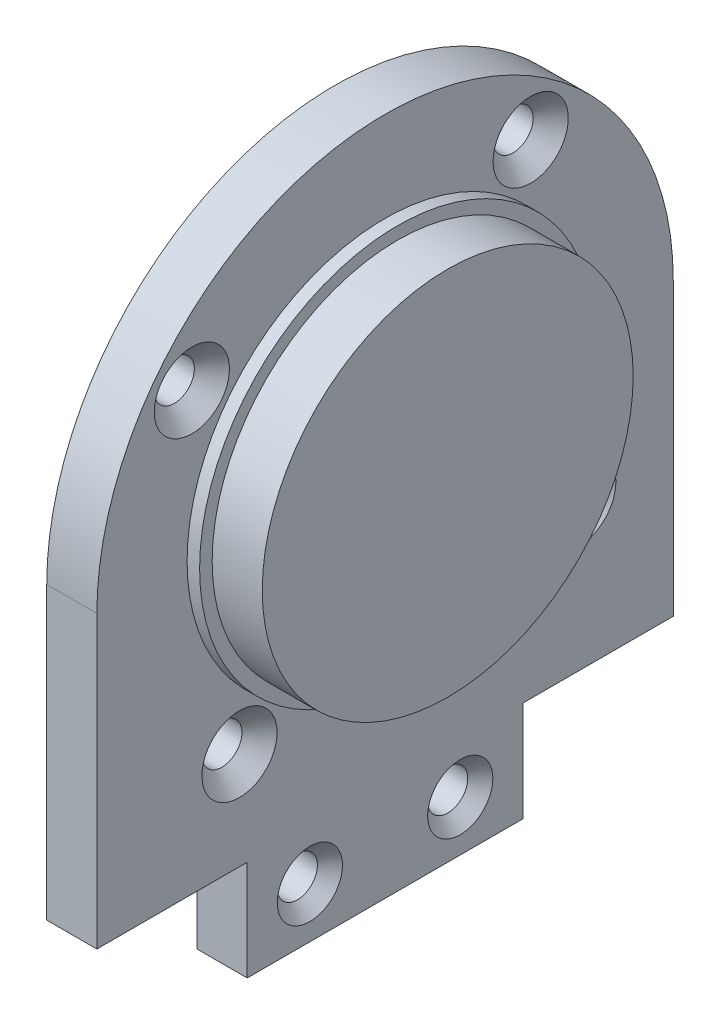
ISO-10303-21;
HEADER;
FILE_DESCRIPTION(('STEP AP214'),'2;1');
FILE_NAME('part.step','',(''),(''),'','','');
FILE_SCHEMA(('AUTOMOTIVE_DESIGN { 1 0 10303 214 1 1 1 1 }'));
ENDSEC;
DATA;
#1=APPLICATION_CONTEXT('core data for automotive mechanical design processes');
#2=APPLICATION_PROTOCOL_DEFINITION('international standard','automotive_design',2000,#1);
#3=PRODUCT_CONTEXT('',#1,'mechanical');
#4=PRODUCT('Part','Part','',(#3));
#5=PRODUCT_RELATED_PRODUCT_CATEGORY('part','',(#4));
#6=PRODUCT_DEFINITION_FORMATION('','',#4);
#7=PRODUCT_DEFINITION_CONTEXT('part definition',#1,'design');
#8=PRODUCT_DEFINITION('design','',#6,#7);
#9=PRODUCT_DEFINITION_SHAPE('','',#8);
#10=(LENGTH_UNIT() NAMED_UNIT(*) SI_UNIT(.MILLI.,.METRE.));
#11=(NAMED_UNIT(*) PLANE_ANGLE_UNIT() SI_UNIT($,.RADIAN.));
#12=(NAMED_UNIT(*) SI_UNIT($,.STERADIAN.) SOLID_ANGLE_UNIT());
#13=UNCERTAINTY_MEASURE_WITH_UNIT(LENGTH_MEASURE(1.E-05),#10,'distance_accuracy_value','');
#14=(GEOMETRIC_REPRESENTATION_CONTEXT(3) GLOBAL_UNCERTAINTY_ASSIGNED_CONTEXT((#13)) GLOBAL_UNIT_ASSIGNED_CONTEXT((#10,
#11,#12)) REPRESENTATION_CONTEXT('',''));
#15=CARTESIAN_POINT('',(0.,0.,0.));
#16=DIRECTION('',(0.,0.,1.));
#17=DIRECTION('',(1.,0.,0.));
#18=AXIS2_PLACEMENT_3D('',#15,#16,#17);
#19=CARTESIAN_POINT('',(4.,-23.2,0.));
#20=DIRECTION('',(0.,1.,0.));
#21=DIRECTION('',(0.,0.,1.));
#22=AXIS2_PLACEMENT_3D('',#19,#20,#21);
#23=PLANE('',#22);
#24=DIRECTION('',(-1.,0.,0.));
#25=VECTOR('',#24,1.);
#26=CARTESIAN_POINT('',(4.,-23.2,11.));
#27=LINE('',#26,#25);
#28=CARTESIAN_POINT('',(4.,-23.2,11.));
#29=VERTEX_POINT('',#28);
#30=CARTESIAN_POINT('',(0.,-23.2,11.));
#31=VERTEX_POINT('',#30);
#32=EDGE_CURVE('E150',#29,#31,#27,.T.);
#33=ORIENTED_EDGE('',*,*,#32,.F.);
#34=DIRECTION('',(0.,0.,-1.));
#35=VECTOR('',#34,1.);
#36=CARTESIAN_POINT('',(4.,-23.2,0.));
#37=LINE('',#36,#35);
#38=CARTESIAN_POINT('',(4.,-23.2,23.));
#39=VERTEX_POINT('',#38);
#40=EDGE_CURVE('E158',#39,#29,#37,.T.);
#41=ORIENTED_EDGE('',*,*,#40,.F.);
#42=DIRECTION('',(-1.,0.,0.));
#43=VECTOR('',#42,1.);
#44=CARTESIAN_POINT('',(4.,-23.2,23.));
#45=LINE('',#44,#43);
#46=CARTESIAN_POINT('',(0.,-23.2,23.));
#47=VERTEX_POINT('',#46);
#48=EDGE_CURVE('E183',#39,#47,#45,.T.);
#49=ORIENTED_EDGE('',*,*,#48,.T.);
#50=DIRECTION('',(0.,0.,-1.));
#51=VECTOR('',#50,1.);
#52=CARTESIAN_POINT('',(0.,-23.2,0.));
#53=LINE('',#52,#51);
#54=EDGE_CURVE('E176',#47,#31,#53,.T.);
#55=ORIENTED_EDGE('',*,*,#54,.T.);
#56=EDGE_LOOP('',(#33,#41,#49,#55));
#57=FACE_BOUND('',#56,.T.);
#58=ADVANCED_FACE('F48',(#57),#23,.F.);
#59=CARTESIAN_POINT('',(4.,0.,0.));
#60=DIRECTION('',(-1.,0.,0.));
#61=DIRECTION('',(0.,0.,1.));
#62=AXIS2_PLACEMENT_3D('',#59,#60,#61);
#63=CYLINDRICAL_SURFACE('',#62,23.);
#64=CARTESIAN_POINT('',(0.,0.,0.));
#65=DIRECTION('',(1.,0.,0.));
#66=DIRECTION('',(0.,0.,-1.));
#67=AXIS2_PLACEMENT_3D('',#64,#65,#66);
#68=CIRCLE('',#67,23.);
#69=CARTESIAN_POINT('',(0.,0.,-23.));
#70=VERTEX_POINT('',#69);
#71=CARTESIAN_POINT('',(0.,0.,23.));
#72=VERTEX_POINT('',#71);
#73=EDGE_CURVE('E170',#70,#72,#68,.T.);
#74=ORIENTED_EDGE('',*,*,#73,.T.);
#75=DIRECTION('',(-1.,0.,0.));
#76=VECTOR('',#75,1.);
#77=CARTESIAN_POINT('',(4.,0.,23.));
#78=LINE('',#77,#76);
#79=CARTESIAN_POINT('',(4.,0.,23.));
#80=VERTEX_POINT('',#79);
#81=EDGE_CURVE('E186',#80,#72,#78,.T.);
#82=ORIENTED_EDGE('',*,*,#81,.F.);
#83=CARTESIAN_POINT('',(4.,0.,0.));
#84=DIRECTION('',(1.,0.,0.));
#85=DIRECTION('',(0.,0.,-1.));
#86=AXIS2_PLACEMENT_3D('',#83,#84,#85);
#87=CIRCLE('',#86,23.);
#88=CARTESIAN_POINT('',(4.,0.,-23.));
#89=VERTEX_POINT('',#88);
#90=EDGE_CURVE('E154',#89,#80,#87,.T.);
#91=ORIENTED_EDGE('',*,*,#90,.F.);
#92=DIRECTION('',(-1.,0.,0.));
#93=VECTOR('',#92,1.);
#94=CARTESIAN_POINT('',(4.,0.,-23.));
#95=LINE('',#94,#93);
#96=EDGE_CURVE('E160',#89,#70,#95,.T.);
#97=ORIENTED_EDGE('',*,*,#96,.T.);
#98=EDGE_LOOP('',(#74,#82,#91,#97));
#99=FACE_BOUND('',#98,.T.);
#100=ADVANCED_FACE('F239',(#99),#63,.T.);
#101=CARTESIAN_POINT('',(4.,0.,23.));
#102=DIRECTION('',(0.,0.,-1.));
#103=DIRECTION('',(0.,1.,0.));
#104=AXIS2_PLACEMENT_3D('',#101,#102,#103);
#105=PLANE('',#104);
#106=DIRECTION('',(0.,-1.,0.));
#107=VECTOR('',#106,1.);
#108=CARTESIAN_POINT('',(0.,0.,23.));
#109=LINE('',#108,#107);
#110=EDGE_CURVE('E173',#72,#47,#109,.T.);
#111=ORIENTED_EDGE('',*,*,#110,.T.);
#112=ORIENTED_EDGE('',*,*,#48,.F.);
#113=DIRECTION('',(0.,-1.,0.));
#114=VECTOR('',#113,1.);
#115=CARTESIAN_POINT('',(4.,0.,23.));
#116=LINE('',#115,#114);
#117=EDGE_CURVE('E103',#80,#39,#116,.T.);
#118=ORIENTED_EDGE('',*,*,#117,.F.);
#119=ORIENTED_EDGE('',*,*,#81,.T.);
#120=EDGE_LOOP('',(#111,#112,#118,#119));
#121=FACE_BOUND('',#120,.T.);
#122=ADVANCED_FACE('F246',(#121),#105,.F.);
#123=CARTESIAN_POINT('',(4.,-23.2,-11.));
#124=VERTEX_POINT('',#123);
#125=CARTESIAN_POINT('',(4.,-23.2,-23.));
#126=VERTEX_POINT('',#125);
#127=EDGE_CURVE('E157',#124,#126,#37,.T.);
#128=ORIENTED_EDGE('',*,*,#127,.F.);
#129=DIRECTION('',(-1.,0.,0.));
#130=VECTOR('',#129,1.);
#131=CARTESIAN_POINT('',(4.,-23.2,-11.));
#132=LINE('',#131,#130);
#133=CARTESIAN_POINT('',(0.,-23.2,-11.));
#134=VERTEX_POINT('',#133);
#135=EDGE_CURVE('E129',#124,#134,#132,.T.);
#136=ORIENTED_EDGE('',*,*,#135,.T.);
#137=CARTESIAN_POINT('',(0.,-23.2,-23.));
#138=VERTEX_POINT('',#137);
#139=EDGE_CURVE('E175',#134,#138,#53,.T.);
#140=ORIENTED_EDGE('',*,*,#139,.T.);
#141=DIRECTION('',(-1.,0.,0.));
#142=VECTOR('',#141,1.);
#143=CARTESIAN_POINT('',(4.,-23.2,-23.));
#144=LINE('',#143,#142);
#145=EDGE_CURVE('E181',#126,#138,#144,.T.);
#146=ORIENTED_EDGE('',*,*,#145,.F.);
#147=EDGE_LOOP('',(#128,#136,#140,#146));
#148=FACE_BOUND('',#147,.T.);
#149=ADVANCED_FACE('F242',(#148),#23,.F.);
#150=CARTESIAN_POINT('',(4.,11.6198849928379,15.4201082075704));
#151=DIRECTION('',(-1.,0.,0.));
#152=DIRECTION('',(0.,0.,1.));
#153=AXIS2_PLACEMENT_3D('',#150,#151,#152);
#154=CYLINDRICAL_SURFACE('',#153,1.6);
#155=CARTESIAN_POINT('',(2.6,11.6198849928379,15.4201082075704));
#156=DIRECTION('',(1.,0.,0.));
#157=DIRECTION('',(0.,0.,-1.));
#158=AXIS2_PLACEMENT_3D('',#155,#156,#157);
#159=CIRCLE('',#158,1.6);
#160=CARTESIAN_POINT('',(2.6,11.6198849928379,13.8201082075704));
#161=VERTEX_POINT('',#160);
#162=EDGE_CURVE('E209',#161,#161,#159,.T.);
#163=ORIENTED_EDGE('',*,*,#162,.T.);
#164=EDGE_LOOP('',(#163));
#165=FACE_BOUND('',#164,.T.);
#166=CARTESIAN_POINT('',(0.,11.6198849928379,15.4201082075704));
#167=DIRECTION('',(1.,0.,0.));
#168=DIRECTION('',(0.,0.,-1.));
#169=AXIS2_PLACEMENT_3D('',#166,#167,#168);
#170=CIRCLE('',#169,1.6);
#171=CARTESIAN_POINT('',(0.,11.6198849928379,13.8201082075704));
#172=VERTEX_POINT('',#171);
#173=EDGE_CURVE('E167',#172,#172,#170,.T.);
#174=ORIENTED_EDGE('',*,*,#173,.F.);
#175=EDGE_LOOP('',(#174));
#176=FACE_BOUND('',#175,.T.);
#177=ADVANCED_FACE('F253',(#165,#176),#154,.F.);
#178=CARTESIAN_POINT('',(4.,15.4201082075712,-11.6198849928378));
#179=DIRECTION('',(-1.,0.,0.));
#180=DIRECTION('',(0.,0.,1.));
#181=AXIS2_PLACEMENT_3D('',#178,#179,#180);
#182=CYLINDRICAL_SURFACE('',#181,1.60000000000081);
#183=CARTESIAN_POINT('',(2.59999999999999,15.4201082075712,-11.6198849928378));
#184=DIRECTION('',(1.,0.,0.));
#185=DIRECTION('',(0.,0.,-1.));
#186=AXIS2_PLACEMENT_3D('',#183,#184,#185);
#187=CIRCLE('',#186,1.60000000000081);
#188=CARTESIAN_POINT('',(2.59999999999999,15.4201082075712,-13.2198849928386));
#189=VERTEX_POINT('',#188);
#190=EDGE_CURVE('E206',#189,#189,#187,.T.);
#191=ORIENTED_EDGE('',*,*,#190,.T.);
#192=EDGE_LOOP('',(#191));
#193=FACE_BOUND('',#192,.T.);
#194=CARTESIAN_POINT('',(0.,15.4201082075712,-11.6198849928378));
#195=DIRECTION('',(1.,0.,0.));
#196=DIRECTION('',(0.,0.,-1.));
#197=AXIS2_PLACEMENT_3D('',#194,#195,#196);
#198=CIRCLE('',#197,1.60000000000081);
#199=CARTESIAN_POINT('',(0.,15.4201082075712,-13.2198849928386));
#200=VERTEX_POINT('',#199);
#201=EDGE_CURVE('E164',#200,#200,#198,.T.);
#202=ORIENTED_EDGE('',*,*,#201,.F.);
#203=EDGE_LOOP('',(#202));
#204=FACE_BOUND('',#203,.T.);
#205=ADVANCED_FACE('F259',(#193,#204),#182,.F.);
#206=CARTESIAN_POINT('',(4.,-11.619884992837,-15.4201082075711));
#207=DIRECTION('',(-1.,0.,0.));
#208=DIRECTION('',(0.,0.,1.));
#209=AXIS2_PLACEMENT_3D('',#206,#207,#208);
#210=CYLINDRICAL_SURFACE('',#209,1.60000000000099);
#211=CARTESIAN_POINT('',(2.6,-11.619884992837,-15.4201082075711));
#212=DIRECTION('',(1.,0.,0.));
#213=DIRECTION('',(0.,0.,-1.));
#214=AXIS2_PLACEMENT_3D('',#211,#212,#213);
#215=CIRCLE('',#214,1.60000000000099);
#216=CARTESIAN_POINT('',(2.6,-11.619884992837,-17.0201082075721));
#217=VERTEX_POINT('',#216);
#218=EDGE_CURVE('E188',#217,#217,#215,.T.);
#219=ORIENTED_EDGE('',*,*,#218,.T.);
#220=EDGE_LOOP('',(#219));
#221=FACE_BOUND('',#220,.T.);
#222=CARTESIAN_POINT('',(0.,-11.619884992837,-15.4201082075711));
#223=DIRECTION('',(1.,0.,0.));
#224=DIRECTION('',(0.,0.,-1.));
#225=AXIS2_PLACEMENT_3D('',#222,#223,#224);
#226=CIRCLE('',#225,1.60000000000099);
#227=CARTESIAN_POINT('',(0.,-11.619884992837,-17.0201082075721));
#228=VERTEX_POINT('',#227);
#229=EDGE_CURVE('E148',#228,#228,#226,.T.);
#230=ORIENTED_EDGE('',*,*,#229,.F.);
#231=EDGE_LOOP('',(#230));
#232=FACE_BOUND('',#231,.T.);
#233=ADVANCED_FACE('F337',(#221,#232),#210,.F.);
#234=CARTESIAN_POINT('',(4.,-15.4201082075703,11.6198849928371));
#235=DIRECTION('',(-1.,0.,0.));
#236=DIRECTION('',(0.,0.,1.));
#237=AXIS2_PLACEMENT_3D('',#234,#235,#236);
#238=CYLINDRICAL_SURFACE('',#237,1.60000000000029);
#239=CARTESIAN_POINT('',(2.59999999999998,-15.4201082075703,11.6198849928371));
#240=DIRECTION('',(1.,0.,0.));
#241=DIRECTION('',(0.,0.,-1.));
#242=AXIS2_PLACEMENT_3D('',#239,#240,#241);
#243=CIRCLE('',#242,1.60000000000029);
#244=CARTESIAN_POINT('',(2.59999999999998,-15.4201082075703,10.0198849928368));
#245=VERTEX_POINT('',#244);
#246=EDGE_CURVE('E203',#245,#245,#243,.T.);
#247=ORIENTED_EDGE('',*,*,#246,.T.);
#248=EDGE_LOOP('',(#247));
#249=FACE_BOUND('',#248,.T.);
#250=CARTESIAN_POINT('',(0.,-15.4201082075703,11.6198849928371));
#251=DIRECTION('',(1.,0.,0.));
#252=DIRECTION('',(0.,0.,-1.));
#253=AXIS2_PLACEMENT_3D('',#250,#251,#252);
#254=CIRCLE('',#253,1.60000000000029);
#255=CARTESIAN_POINT('',(0.,-15.4201082075703,10.0198849928368));
#256=VERTEX_POINT('',#255);
#257=EDGE_CURVE('E145',#256,#256,#254,.T.);
#258=ORIENTED_EDGE('',*,*,#257,.F.);
#259=EDGE_LOOP('',(#258));
#260=FACE_BOUND('',#259,.T.);
#261=ADVANCED_FACE('F333',(#249,#260),#238,.F.);
#262=CARTESIAN_POINT('',(4.,0.,-23.));
#263=DIRECTION('',(0.,0.,1.));
#264=DIRECTION('',(0.,-1.,0.));
#265=AXIS2_PLACEMENT_3D('',#262,#263,#264);
#266=PLANE('',#265);
#267=DIRECTION('',(0.,1.,0.));
#268=VECTOR('',#267,1.);
#269=CARTESIAN_POINT('',(0.,0.,-23.));
#270=LINE('',#269,#268);
#271=EDGE_CURVE('E95',#138,#70,#270,.T.);
#272=ORIENTED_EDGE('',*,*,#271,.T.);
#273=ORIENTED_EDGE('',*,*,#96,.F.);
#274=DIRECTION('',(0.,1.,0.));
#275=VECTOR('',#274,1.);
#276=CARTESIAN_POINT('',(4.,0.,-23.));
#277=LINE('',#276,#275);
#278=EDGE_CURVE('E74',#126,#89,#277,.T.);
#279=ORIENTED_EDGE('',*,*,#278,.F.);
#280=ORIENTED_EDGE('',*,*,#145,.T.);
#281=EDGE_LOOP('',(#272,#273,#279,#280));
#282=FACE_BOUND('',#281,.T.);
#283=ADVANCED_FACE('F264',(#282),#266,.F.);
#284=CARTESIAN_POINT('',(4.,0.,0.));
#285=DIRECTION('',(1.,0.,0.));
#286=DIRECTION('',(0.,0.,-1.));
#287=AXIS2_PLACEMENT_3D('',#284,#285,#286);
#288=PLANE('',#287);
#289=CARTESIAN_POINT('',(4.,0.,0.));
#290=DIRECTION('',(1.,0.,0.));
#291=DIRECTION('',(0.,0.,-1.));
#292=AXIS2_PLACEMENT_3D('',#289,#290,#291);
#293=CIRCLE('',#292,15.8);
#294=CARTESIAN_POINT('',(4.,0.,-15.8));
#295=VERTEX_POINT('',#294);
#296=EDGE_CURVE('E288',#295,#295,#293,.T.);
#297=ORIENTED_EDGE('',*,*,#296,.F.);
#298=EDGE_LOOP('',(#297));
#299=FACE_BOUND('',#298,.T.);
#300=CARTESIAN_POINT('',(4.,-27.2,-6.));
#301=DIRECTION('',(1.,0.,0.));
#302=DIRECTION('',(0.,0.,-1.));
#303=AXIS2_PLACEMENT_3D('',#300,#301,#302);
#304=CIRCLE('',#303,2.60000000000002);
#305=CARTESIAN_POINT('',(4.,-27.2,-8.60000000000003));
#306=VERTEX_POINT('',#305);
#307=EDGE_CURVE('E11',#306,#306,#304,.F.);
#308=ORIENTED_EDGE('',*,*,#307,.T.);
#309=EDGE_LOOP('',(#308));
#310=FACE_BOUND('',#309,.T.);
#311=CARTESIAN_POINT('',(4.,-27.2,6.));
#312=DIRECTION('',(1.,0.,0.));
#313=DIRECTION('',(0.,0.,-1.));
#314=AXIS2_PLACEMENT_3D('',#311,#312,#313);
#315=CIRCLE('',#314,2.60000000000002);
#316=CARTESIAN_POINT('',(4.,-27.2,3.39999999999997));
#317=VERTEX_POINT('',#316);
#318=EDGE_CURVE('E215',#317,#317,#315,.F.);
#319=ORIENTED_EDGE('',*,*,#318,.T.);
#320=EDGE_LOOP('',(#319));
#321=FACE_BOUND('',#320,.T.);
#322=CARTESIAN_POINT('',(4.,-11.619884992837,-15.4201082075711));
#323=DIRECTION('',(1.,0.,0.));
#324=DIRECTION('',(0.,0.,-1.));
#325=AXIS2_PLACEMENT_3D('',#322,#323,#324);
#326=CIRCLE('',#325,3.00000000000101);
#327=CARTESIAN_POINT('',(4.,-11.619884992837,-18.4201082075721));
#328=VERTEX_POINT('',#327);
#329=EDGE_CURVE('E200',#328,#328,#326,.F.);
#330=ORIENTED_EDGE('',*,*,#329,.T.);
#331=EDGE_LOOP('',(#330));
#332=FACE_BOUND('',#331,.T.);
#333=CARTESIAN_POINT('',(4.,-15.4201082075703,11.6198849928371));
#334=DIRECTION('',(1.,0.,0.));
#335=DIRECTION('',(0.,0.,-1.));
#336=AXIS2_PLACEMENT_3D('',#333,#334,#335);
#337=CIRCLE('',#336,3.00000000000032);
#338=CARTESIAN_POINT('',(4.,-15.4201082075703,8.6198849928368));
#339=VERTEX_POINT('',#338);
#340=EDGE_CURVE('E197',#339,#339,#337,.F.);
#341=ORIENTED_EDGE('',*,*,#340,.T.);
#342=EDGE_LOOP('',(#341));
#343=FACE_BOUND('',#342,.T.);
#344=CARTESIAN_POINT('',(4.,15.4201082075712,-11.6198849928378));
#345=DIRECTION('',(1.,0.,0.));
#346=DIRECTION('',(0.,0.,-1.));
#347=AXIS2_PLACEMENT_3D('',#344,#345,#346);
#348=CIRCLE('',#347,3.00000000000083);
#349=CARTESIAN_POINT('',(4.,15.4201082075712,-14.6198849928386));
#350=VERTEX_POINT('',#349);
#351=EDGE_CURVE('E194',#350,#350,#348,.F.);
#352=ORIENTED_EDGE('',*,*,#351,.T.);
#353=EDGE_LOOP('',(#352));
#354=FACE_BOUND('',#353,.T.);
#355=CARTESIAN_POINT('',(4.,11.6198849928379,15.4201082075704));
#356=DIRECTION('',(1.,0.,0.));
#357=DIRECTION('',(0.,0.,-1.));
#358=AXIS2_PLACEMENT_3D('',#355,#356,#357);
#359=CIRCLE('',#358,3.00000000000001);
#360=CARTESIAN_POINT('',(4.,11.6198849928379,12.4201082075704));
#361=VERTEX_POINT('',#360);
#362=EDGE_CURVE('E191',#361,#361,#359,.F.);
#363=ORIENTED_EDGE('',*,*,#362,.T.);
#364=EDGE_LOOP('',(#363));
#365=FACE_BOUND('',#364,.T.);
#366=ORIENTED_EDGE('',*,*,#90,.T.);
#367=ORIENTED_EDGE('',*,*,#117,.T.);
#368=ORIENTED_EDGE('',*,*,#40,.T.);
#369=DIRECTION('',(0.,-1.,0.));
#370=VECTOR('',#369,1.);
#371=CARTESIAN_POINT('',(4.,0.,11.));
#372=LINE('',#371,#370);
#373=CARTESIAN_POINT('',(4.,-31.2,11.));
#374=VERTEX_POINT('',#373);
#375=EDGE_CURVE('E131',#29,#374,#372,.T.);
#376=ORIENTED_EDGE('',*,*,#375,.T.);
#377=DIRECTION('',(0.,0.,-1.));
#378=VECTOR('',#377,1.);
#379=CARTESIAN_POINT('',(4.,-31.2,0.));
#380=LINE('',#379,#378);
#381=CARTESIAN_POINT('',(4.,-31.2,-11.));
#382=VERTEX_POINT('',#381);
#383=EDGE_CURVE('E132',#374,#382,#380,.T.);
#384=ORIENTED_EDGE('',*,*,#383,.T.);
#385=DIRECTION('',(0.,1.,0.));
#386=VECTOR('',#385,1.);
#387=CARTESIAN_POINT('',(4.,0.,-11.));
#388=LINE('',#387,#386);
#389=EDGE_CURVE('E123',#382,#124,#388,.T.);
#390=ORIENTED_EDGE('',*,*,#389,.T.);
#391=ORIENTED_EDGE('',*,*,#127,.T.);
#392=ORIENTED_EDGE('',*,*,#278,.T.);
#393=EDGE_LOOP('',(#366,#367,#368,#376,#384,#390,#391,#392));
#394=FACE_BOUND('',#393,.T.);
#395=ADVANCED_FACE('F135',(#299,#310,#321,#332,#343,#354,#365,#394),#288,.T.);
#396=CARTESIAN_POINT('',(0.,0.,0.));
#397=DIRECTION('',(1.,0.,0.));
#398=DIRECTION('',(0.,0.,-1.));
#399=AXIS2_PLACEMENT_3D('',#396,#397,#398);
#400=PLANE('',#399);
#401=ORIENTED_EDGE('',*,*,#257,.T.);
#402=EDGE_LOOP('',(#401));
#403=FACE_BOUND('',#402,.T.);
#404=ORIENTED_EDGE('',*,*,#229,.T.);
#405=EDGE_LOOP('',(#404));
#406=FACE_BOUND('',#405,.T.);
#407=ORIENTED_EDGE('',*,*,#201,.T.);
#408=EDGE_LOOP('',(#407));
#409=FACE_BOUND('',#408,.T.);
#410=ORIENTED_EDGE('',*,*,#173,.T.);
#411=EDGE_LOOP('',(#410));
#412=FACE_BOUND('',#411,.T.);
#413=ORIENTED_EDGE('',*,*,#73,.F.);
#414=ORIENTED_EDGE('',*,*,#271,.F.);
#415=ORIENTED_EDGE('',*,*,#139,.F.);
#416=DIRECTION('',(0.,1.,0.));
#417=VECTOR('',#416,1.);
#418=CARTESIAN_POINT('',(0.,0.,-11.));
#419=LINE('',#418,#417);
#420=CARTESIAN_POINT('',(0.,-31.2,-11.));
#421=VERTEX_POINT('',#420);
#422=EDGE_CURVE('E65',#421,#134,#419,.T.);
#423=ORIENTED_EDGE('',*,*,#422,.F.);
#424=DIRECTION('',(0.,0.,-1.));
#425=VECTOR('',#424,1.);
#426=CARTESIAN_POINT('',(0.,-31.2,0.));
#427=LINE('',#426,#425);
#428=CARTESIAN_POINT('',(0.,-31.2,11.));
#429=VERTEX_POINT('',#428);
#430=EDGE_CURVE('E144',#429,#421,#427,.T.);
#431=ORIENTED_EDGE('',*,*,#430,.F.);
#432=DIRECTION('',(0.,-1.,0.));
#433=VECTOR('',#432,1.);
#434=CARTESIAN_POINT('',(0.,0.,11.));
#435=LINE('',#434,#433);
#436=EDGE_CURVE('E140',#31,#429,#435,.T.);
#437=ORIENTED_EDGE('',*,*,#436,.F.);
#438=ORIENTED_EDGE('',*,*,#54,.F.);
#439=ORIENTED_EDGE('',*,*,#110,.F.);
#440=EDGE_LOOP('',(#413,#414,#415,#423,#431,#437,#438,#439));
#441=FACE_BOUND('',#440,.T.);
#442=CARTESIAN_POINT('',(0.,-27.2,6.));
#443=DIRECTION('',(1.,0.,0.));
#444=DIRECTION('',(0.,0.,-1.));
#445=AXIS2_PLACEMENT_3D('',#442,#443,#444);
#446=CIRCLE('',#445,1.6);
#447=CARTESIAN_POINT('',(0.,-27.2,4.4));
#448=VERTEX_POINT('',#447);
#449=EDGE_CURVE('E281',#448,#448,#446,.T.);
#450=ORIENTED_EDGE('',*,*,#449,.T.);
#451=EDGE_LOOP('',(#450));
#452=FACE_BOUND('',#451,.T.);
#453=CARTESIAN_POINT('',(0.,-27.2,-6.));
#454=DIRECTION('',(1.,0.,0.));
#455=DIRECTION('',(0.,0.,-1.));
#456=AXIS2_PLACEMENT_3D('',#453,#454,#455);
#457=CIRCLE('',#456,1.6);
#458=CARTESIAN_POINT('',(0.,-27.2,-7.6));
#459=VERTEX_POINT('',#458);
#460=EDGE_CURVE('E278',#459,#459,#457,.T.);
#461=ORIENTED_EDGE('',*,*,#460,.T.);
#462=EDGE_LOOP('',(#461));
#463=FACE_BOUND('',#462,.T.);
#464=ADVANCED_FACE('F321',(#403,#406,#409,#412,#441,#452,#463),#400,.F.);
#465=CARTESIAN_POINT('',(4.,-31.2,0.));
#466=DIRECTION('',(0.,1.,0.));
#467=DIRECTION('',(0.,0.,1.));
#468=AXIS2_PLACEMENT_3D('',#465,#466,#467);
#469=PLANE('',#468);
#470=ORIENTED_EDGE('',*,*,#430,.T.);
#471=DIRECTION('',(-1.,0.,0.));
#472=VECTOR('',#471,1.);
#473=CARTESIAN_POINT('',(4.,-31.2,-11.));
#474=LINE('',#473,#472);
#475=EDGE_CURVE('E127',#382,#421,#474,.T.);
#476=ORIENTED_EDGE('',*,*,#475,.F.);
#477=ORIENTED_EDGE('',*,*,#383,.F.);
#478=DIRECTION('',(-1.,0.,0.));
#479=VECTOR('',#478,1.);
#480=CARTESIAN_POINT('',(4.,-31.2,11.));
#481=LINE('',#480,#479);
#482=EDGE_CURVE('E272',#374,#429,#481,.T.);
#483=ORIENTED_EDGE('',*,*,#482,.T.);
#484=EDGE_LOOP('',(#470,#476,#477,#483));
#485=FACE_BOUND('',#484,.T.);
#486=ADVANCED_FACE('F142',(#485),#469,.F.);
#487=CARTESIAN_POINT('',(4.,0.,-11.));
#488=DIRECTION('',(0.,0.,1.));
#489=DIRECTION('',(1.,0.,0.));
#490=AXIS2_PLACEMENT_3D('',#487,#488,#489);
#491=PLANE('',#490);
#492=ORIENTED_EDGE('',*,*,#422,.T.);
#493=ORIENTED_EDGE('',*,*,#135,.F.);
#494=ORIENTED_EDGE('',*,*,#389,.F.);
#495=ORIENTED_EDGE('',*,*,#475,.T.);
#496=EDGE_LOOP('',(#492,#493,#494,#495));
#497=FACE_BOUND('',#496,.T.);
#498=ADVANCED_FACE('F125',(#497),#491,.F.);
#499=CARTESIAN_POINT('',(4.,-27.2,-6.));
#500=DIRECTION('',(-1.,0.,0.));
#501=DIRECTION('',(0.,0.,1.));
#502=AXIS2_PLACEMENT_3D('',#499,#500,#501);
#503=CYLINDRICAL_SURFACE('',#502,1.6);
#504=CARTESIAN_POINT('',(2.99999999999998,-27.2,-6.));
#505=DIRECTION('',(1.,0.,0.));
#506=DIRECTION('',(0.,0.,-1.));
#507=AXIS2_PLACEMENT_3D('',#504,#505,#506);
#508=CIRCLE('',#507,1.6);
#509=CARTESIAN_POINT('',(2.99999999999998,-27.2,-7.6));
#510=VERTEX_POINT('',#509);
#511=EDGE_CURVE('E58',#510,#510,#508,.T.);
#512=ORIENTED_EDGE('',*,*,#511,.T.);
#513=EDGE_LOOP('',(#512));
#514=FACE_BOUND('',#513,.T.);
#515=ORIENTED_EDGE('',*,*,#460,.F.);
#516=EDGE_LOOP('',(#515));
#517=FACE_BOUND('',#516,.T.);
#518=ADVANCED_FACE('F221',(#514,#517),#503,.F.);
#519=CARTESIAN_POINT('',(4.,-27.2,6.));
#520=DIRECTION('',(-1.,0.,0.));
#521=DIRECTION('',(0.,0.,1.));
#522=AXIS2_PLACEMENT_3D('',#519,#520,#521);
#523=CYLINDRICAL_SURFACE('',#522,1.6);
#524=CARTESIAN_POINT('',(2.99999999999998,-27.2,6.));
#525=DIRECTION('',(1.,0.,0.));
#526=DIRECTION('',(0.,0.,-1.));
#527=AXIS2_PLACEMENT_3D('',#524,#525,#526);
#528=CIRCLE('',#527,1.6);
#529=CARTESIAN_POINT('',(2.99999999999998,-27.2,4.4));
#530=VERTEX_POINT('',#529);
#531=EDGE_CURVE('E212',#530,#530,#528,.T.);
#532=ORIENTED_EDGE('',*,*,#531,.T.);
#533=EDGE_LOOP('',(#532));
#534=FACE_BOUND('',#533,.T.);
#535=ORIENTED_EDGE('',*,*,#449,.F.);
#536=EDGE_LOOP('',(#535));
#537=FACE_BOUND('',#536,.T.);
#538=ADVANCED_FACE('F316',(#534,#537),#523,.F.);
#539=CARTESIAN_POINT('',(4.,0.,11.));
#540=DIRECTION('',(0.,0.,-1.));
#541=DIRECTION('',(-1.,0.,0.));
#542=AXIS2_PLACEMENT_3D('',#539,#540,#541);
#543=PLANE('',#542);
#544=ORIENTED_EDGE('',*,*,#436,.T.);
#545=ORIENTED_EDGE('',*,*,#482,.F.);
#546=ORIENTED_EDGE('',*,*,#375,.F.);
#547=ORIENTED_EDGE('',*,*,#32,.T.);
#548=EDGE_LOOP('',(#544,#545,#546,#547));
#549=FACE_BOUND('',#548,.T.);
#550=ADVANCED_FACE('F312',(#549),#543,.F.);
#551=CARTESIAN_POINT('',(2.6,-11.619884992837,-15.4201082075711));
#552=DIRECTION('',(1.,0.,0.));
#553=DIRECTION('',(0.,0.,-1.));
#554=AXIS2_PLACEMENT_3D('',#551,#552,#553);
#555=CONICAL_SURFACE('',#554,1.60000000000099,0.785398163397453);
#556=ORIENTED_EDGE('',*,*,#329,.F.);
#557=EDGE_LOOP('',(#556));
#558=FACE_BOUND('',#557,.T.);
#559=ORIENTED_EDGE('',*,*,#218,.F.);
#560=EDGE_LOOP('',(#559));
#561=FACE_BOUND('',#560,.T.);
#562=ADVANCED_FACE('F315',(#558,#561),#555,.F.);
#563=CARTESIAN_POINT('',(2.59999999999998,-15.4201082075703,11.6198849928371));
#564=DIRECTION('',(1.,0.,0.));
#565=DIRECTION('',(0.,0.,-1.));
#566=AXIS2_PLACEMENT_3D('',#563,#564,#565);
#567=CONICAL_SURFACE('',#566,1.60000000000029,0.785398163397453);
#568=ORIENTED_EDGE('',*,*,#340,.F.);
#569=EDGE_LOOP('',(#568));
#570=FACE_BOUND('',#569,.T.);
#571=ORIENTED_EDGE('',*,*,#246,.F.);
#572=EDGE_LOOP('',(#571));
#573=FACE_BOUND('',#572,.T.);
#574=ADVANCED_FACE('F354',(#570,#573),#567,.F.);
#575=CARTESIAN_POINT('',(2.59999999999999,15.4201082075712,-11.6198849928378));
#576=DIRECTION('',(1.,0.,0.));
#577=DIRECTION('',(0.,0.,-1.));
#578=AXIS2_PLACEMENT_3D('',#575,#576,#577);
#579=CONICAL_SURFACE('',#578,1.60000000000081,0.785398163397452);
#580=ORIENTED_EDGE('',*,*,#351,.F.);
#581=EDGE_LOOP('',(#580));
#582=FACE_BOUND('',#581,.T.);
#583=ORIENTED_EDGE('',*,*,#190,.F.);
#584=EDGE_LOOP('',(#583));
#585=FACE_BOUND('',#584,.T.);
#586=ADVANCED_FACE('F361',(#582,#585),#579,.F.);
#587=CARTESIAN_POINT('',(2.6,11.6198849928379,15.4201082075704));
#588=DIRECTION('',(1.,0.,0.));
#589=DIRECTION('',(0.,0.,-1.));
#590=AXIS2_PLACEMENT_3D('',#587,#588,#589);
#591=CONICAL_SURFACE('',#590,1.6,0.785398163397453);
#592=ORIENTED_EDGE('',*,*,#362,.F.);
#593=EDGE_LOOP('',(#592));
#594=FACE_BOUND('',#593,.T.);
#595=ORIENTED_EDGE('',*,*,#162,.F.);
#596=EDGE_LOOP('',(#595));
#597=FACE_BOUND('',#596,.T.);
#598=ADVANCED_FACE('F235',(#594,#597),#591,.F.);
#599=CARTESIAN_POINT('',(2.99999999999998,-27.2,6.));
#600=DIRECTION('',(1.,0.,0.));
#601=DIRECTION('',(0.,0.,-1.));
#602=AXIS2_PLACEMENT_3D('',#599,#600,#601);
#603=CONICAL_SURFACE('',#602,1.6,0.785398163397452);
#604=ORIENTED_EDGE('',*,*,#318,.F.);
#605=EDGE_LOOP('',(#604));
#606=FACE_BOUND('',#605,.T.);
#607=ORIENTED_EDGE('',*,*,#531,.F.);
#608=EDGE_LOOP('',(#607));
#609=FACE_BOUND('',#608,.T.);
#610=ADVANCED_FACE('F226',(#606,#609),#603,.F.);
#611=CARTESIAN_POINT('',(2.99999999999998,-27.2,-6.));
#612=DIRECTION('',(1.,0.,0.));
#613=DIRECTION('',(0.,0.,-1.));
#614=AXIS2_PLACEMENT_3D('',#611,#612,#613);
#615=CONICAL_SURFACE('',#614,1.6,0.785398163397452);
#616=ORIENTED_EDGE('',*,*,#307,.F.);
#617=EDGE_LOOP('',(#616));
#618=FACE_BOUND('',#617,.T.);
#619=ORIENTED_EDGE('',*,*,#511,.F.);
#620=EDGE_LOOP('',(#619));
#621=FACE_BOUND('',#620,.T.);
#622=ADVANCED_FACE('F51',(#618,#621),#615,.F.);
#623=CARTESIAN_POINT('',(5.,0.,0.));
#624=DIRECTION('',(-1.,0.,0.));
#625=DIRECTION('',(0.,0.,1.));
#626=AXIS2_PLACEMENT_3D('',#623,#624,#625);
#627=CYLINDRICAL_SURFACE('',#626,15.8);
#628=CARTESIAN_POINT('',(5.,0.,0.));
#629=DIRECTION('',(1.,0.,0.));
#630=DIRECTION('',(0.,0.,-1.));
#631=AXIS2_PLACEMENT_3D('',#628,#629,#630);
#632=CIRCLE('',#631,15.8);
#633=CARTESIAN_POINT('',(5.,0.,-15.8));
#634=VERTEX_POINT('',#633);
#635=EDGE_CURVE('E291',#634,#634,#632,.T.);
#636=ORIENTED_EDGE('',*,*,#635,.F.);
#637=EDGE_LOOP('',(#636));
#638=FACE_BOUND('',#637,.T.);
#639=ORIENTED_EDGE('',*,*,#296,.T.);
#640=EDGE_LOOP('',(#639));
#641=FACE_BOUND('',#640,.T.);
#642=ADVANCED_FACE('F225',(#638,#641),#627,.T.);
#643=CARTESIAN_POINT('',(5.,0.,0.));
#644=DIRECTION('',(1.,0.,0.));
#645=DIRECTION('',(0.,0.,-1.));
#646=AXIS2_PLACEMENT_3D('',#643,#644,#645);
#647=PLANE('',#646);
#648=CARTESIAN_POINT('',(5.,0.,0.));
#649=DIRECTION('',(1.,0.,0.));
#650=DIRECTION('',(0.,0.,-1.));
#651=AXIS2_PLACEMENT_3D('',#648,#649,#650);
#652=CIRCLE('',#651,14.8);
#653=CARTESIAN_POINT('',(5.,0.,-14.8));
#654=VERTEX_POINT('',#653);
#655=EDGE_CURVE('E53',#654,#654,#652,.T.);
#656=ORIENTED_EDGE('',*,*,#655,.F.);
#657=EDGE_LOOP('',(#656));
#658=FACE_BOUND('',#657,.T.);
#659=ORIENTED_EDGE('',*,*,#635,.T.);
#660=EDGE_LOOP('',(#659));
#661=FACE_BOUND('',#660,.T.);
#662=ADVANCED_FACE('F232',(#658,#661),#647,.T.);
#663=CARTESIAN_POINT('',(9.,0.,0.));
#664=DIRECTION('',(1.,0.,0.));
#665=DIRECTION('',(0.,0.,-1.));
#666=AXIS2_PLACEMENT_3D('',#663,#664,#665);
#667=PLANE('',#666);
#668=CARTESIAN_POINT('',(9.,0.,0.));
#669=DIRECTION('',(1.,0.,0.));
#670=DIRECTION('',(0.,0.,-1.));
#671=AXIS2_PLACEMENT_3D('',#668,#669,#670);
#672=CIRCLE('',#671,14.8);
#673=CARTESIAN_POINT('',(9.,0.,-14.8));
#674=VERTEX_POINT('',#673);
#675=EDGE_CURVE('E284',#674,#674,#672,.T.);
#676=ORIENTED_EDGE('',*,*,#675,.T.);
#677=EDGE_LOOP('',(#676));
#678=FACE_BOUND('',#677,.T.);
#679=ADVANCED_FACE('F302',(#678),#667,.T.);
#680=CARTESIAN_POINT('',(9.,0.,0.));
#681=DIRECTION('',(-1.,0.,0.));
#682=DIRECTION('',(0.,0.,1.));
#683=AXIS2_PLACEMENT_3D('',#680,#681,#682);
#684=CYLINDRICAL_SURFACE('',#683,14.8);
#685=ORIENTED_EDGE('',*,*,#655,.T.);
#686=EDGE_LOOP('',(#685));
#687=FACE_BOUND('',#686,.T.);
#688=ORIENTED_EDGE('',*,*,#675,.F.);
#689=EDGE_LOOP('',(#688));
#690=FACE_BOUND('',#689,.T.);
#691=ADVANCED_FACE('F298',(#687,#690),#684,.T.);
#692=CLOSED_SHELL('',(#58,#100,#122,#149,#177,#205,#233,#261,#283,#395,#464,#486,#498,#518,#538,
#550,#562,#574,#586,#598,#610,#622,#642,#662,#679,#691));
#693=MANIFOLD_SOLID_BREP('B2',#692);
#694=ADVANCED_BREP_SHAPE_REPRESENTATION('',(#18,#693),#14);
#695=SHAPE_DEFINITION_REPRESENTATION(#9,#694);
ENDSEC;
END-ISO-10303-21;
